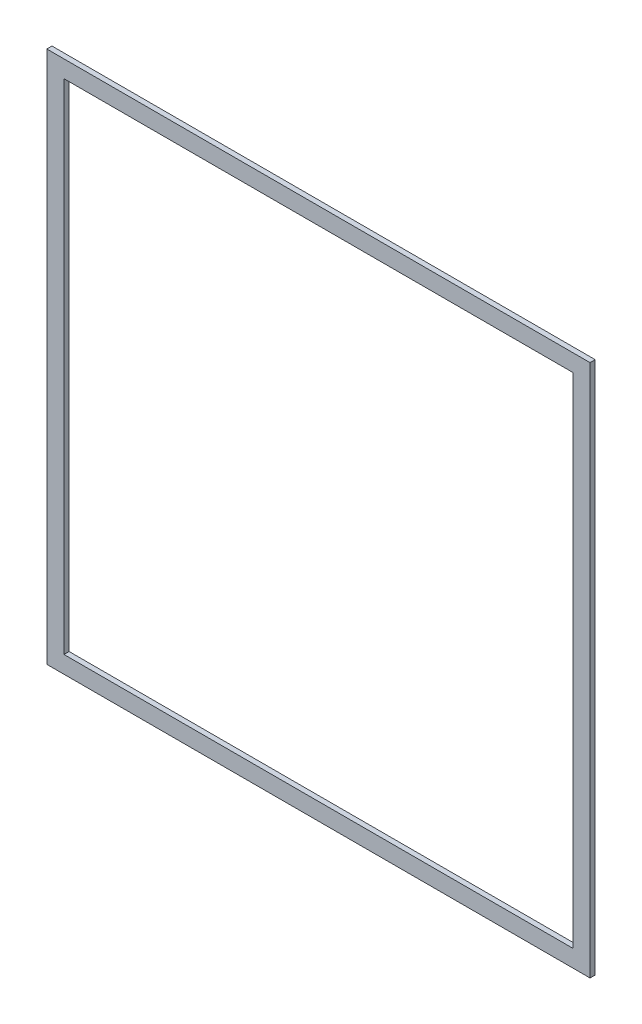
ISO-10303-21;
HEADER;
FILE_DESCRIPTION(('STEP AP214'),'2;1');
FILE_NAME('part.step','',(''),(''),'','','');
FILE_SCHEMA(('AUTOMOTIVE_DESIGN { 1 0 10303 214 1 1 1 1 }'));
ENDSEC;
DATA;
#1=APPLICATION_CONTEXT('core data for automotive mechanical design processes');
#2=APPLICATION_PROTOCOL_DEFINITION('international standard','automotive_design',2000,#1);
#3=PRODUCT_CONTEXT('',#1,'mechanical');
#4=PRODUCT('Part','Part','',(#3));
#5=PRODUCT_RELATED_PRODUCT_CATEGORY('part','',(#4));
#6=PRODUCT_DEFINITION_FORMATION('','',#4);
#7=PRODUCT_DEFINITION_CONTEXT('part definition',#1,'design');
#8=PRODUCT_DEFINITION('design','',#6,#7);
#9=PRODUCT_DEFINITION_SHAPE('','',#8);
#10=(LENGTH_UNIT() NAMED_UNIT(*) SI_UNIT(.MILLI.,.METRE.));
#11=(NAMED_UNIT(*) PLANE_ANGLE_UNIT() SI_UNIT($,.RADIAN.));
#12=(NAMED_UNIT(*) SI_UNIT($,.STERADIAN.) SOLID_ANGLE_UNIT());
#13=UNCERTAINTY_MEASURE_WITH_UNIT(LENGTH_MEASURE(1.E-05),#10,'distance_accuracy_value','');
#14=(GEOMETRIC_REPRESENTATION_CONTEXT(3) GLOBAL_UNCERTAINTY_ASSIGNED_CONTEXT((#13)) GLOBAL_UNIT_ASSIGNED_CONTEXT((#10,
#11,#12)) REPRESENTATION_CONTEXT('',''));
#15=CARTESIAN_POINT('',(0.,0.,0.));
#16=DIRECTION('',(0.,0.,1.));
#17=DIRECTION('',(1.,0.,0.));
#18=AXIS2_PLACEMENT_3D('',#15,#16,#17);
#19=CARTESIAN_POINT('',(0.,0.,3.));
#20=DIRECTION('',(0.,0.,-1.));
#21=DIRECTION('',(-1.,0.,0.));
#22=AXIS2_PLACEMENT_3D('',#19,#20,#21);
#23=PLANE('',#22);
#24=DIRECTION('',(1.,0.,0.));
#25=VECTOR('',#24,1.);
#26=CARTESIAN_POINT('',(10.,0.,3.));
#27=LINE('',#26,#25);
#28=CARTESIAN_POINT('',(0.,0.,3.));
#29=VERTEX_POINT('',#28);
#30=CARTESIAN_POINT('',(316.8,0.,3.));
#31=VERTEX_POINT('',#30);
#32=EDGE_CURVE('E134',#29,#31,#27,.T.);
#33=ORIENTED_EDGE('',*,*,#32,.T.);
#34=DIRECTION('',(0.,1.,0.));
#35=VECTOR('',#34,1.);
#36=CARTESIAN_POINT('',(316.8,310.8,3.));
#37=LINE('',#36,#35);
#38=CARTESIAN_POINT('',(316.8,310.8,3.));
#39=VERTEX_POINT('',#38);
#40=EDGE_CURVE('E136',#31,#39,#37,.T.);
#41=ORIENTED_EDGE('',*,*,#40,.T.);
#42=DIRECTION('',(-1.,0.,0.));
#43=VECTOR('',#42,1.);
#44=CARTESIAN_POINT('',(0.,310.8,3.));
#45=LINE('',#44,#43);
#46=CARTESIAN_POINT('',(0.,310.8,3.));
#47=VERTEX_POINT('',#46);
#48=EDGE_CURVE('E139',#39,#47,#45,.T.);
#49=ORIENTED_EDGE('',*,*,#48,.T.);
#50=DIRECTION('',(0.,-1.,0.));
#51=VECTOR('',#50,1.);
#52=CARTESIAN_POINT('',(0.,0.,3.));
#53=LINE('',#52,#51);
#54=EDGE_CURVE('E141',#47,#29,#53,.T.);
#55=ORIENTED_EDGE('',*,*,#54,.T.);
#56=EDGE_LOOP('',(#33,#41,#49,#55));
#57=FACE_BOUND('',#56,.T.);
#58=DIRECTION('',(0.,-1.,0.));
#59=VECTOR('',#58,1.);
#60=CARTESIAN_POINT('',(10.,300.8,3.));
#61=LINE('',#60,#59);
#62=CARTESIAN_POINT('',(10.,300.8,3.));
#63=VERTEX_POINT('',#62);
#64=CARTESIAN_POINT('',(10.,10.,3.));
#65=VERTEX_POINT('',#64);
#66=EDGE_CURVE('E98',#63,#65,#61,.T.);
#67=ORIENTED_EDGE('',*,*,#66,.F.);
#68=DIRECTION('',(-1.,0.,0.));
#69=VECTOR('',#68,1.);
#70=CARTESIAN_POINT('',(306.8,300.8,3.));
#71=LINE('',#70,#69);
#72=CARTESIAN_POINT('',(306.8,300.8,3.));
#73=VERTEX_POINT('',#72);
#74=EDGE_CURVE('E120',#73,#63,#71,.T.);
#75=ORIENTED_EDGE('',*,*,#74,.F.);
#76=DIRECTION('',(0.,1.,0.));
#77=VECTOR('',#76,1.);
#78=CARTESIAN_POINT('',(306.8,10.,3.));
#79=LINE('',#78,#77);
#80=CARTESIAN_POINT('',(306.8,10.,3.));
#81=VERTEX_POINT('',#80);
#82=EDGE_CURVE('E118',#81,#73,#79,.T.);
#83=ORIENTED_EDGE('',*,*,#82,.F.);
#84=DIRECTION('',(1.,0.,0.));
#85=VECTOR('',#84,1.);
#86=CARTESIAN_POINT('',(10.,10.,3.));
#87=LINE('',#86,#85);
#88=EDGE_CURVE('E106',#65,#81,#87,.T.);
#89=ORIENTED_EDGE('',*,*,#88,.F.);
#90=EDGE_LOOP('',(#67,#75,#83,#89));
#91=FACE_BOUND('',#90,.T.);
#92=ADVANCED_FACE('F33',(#57,#91),#23,.F.);
#93=CARTESIAN_POINT('',(0.,0.,0.));
#94=DIRECTION('',(0.,0.,-1.));
#95=DIRECTION('',(-1.,0.,0.));
#96=AXIS2_PLACEMENT_3D('',#93,#94,#95);
#97=PLANE('',#96);
#98=DIRECTION('',(1.,0.,0.));
#99=VECTOR('',#98,1.);
#100=CARTESIAN_POINT('',(316.8,0.,0.));
#101=LINE('',#100,#99);
#102=CARTESIAN_POINT('',(0.,0.,0.));
#103=VERTEX_POINT('',#102);
#104=CARTESIAN_POINT('',(316.8,0.,0.));
#105=VERTEX_POINT('',#104);
#106=EDGE_CURVE('E114',#103,#105,#101,.T.);
#107=ORIENTED_EDGE('',*,*,#106,.F.);
#108=DIRECTION('',(0.,-1.,0.));
#109=VECTOR('',#108,1.);
#110=CARTESIAN_POINT('',(0.,0.,0.));
#111=LINE('',#110,#109);
#112=CARTESIAN_POINT('',(0.,310.8,0.));
#113=VERTEX_POINT('',#112);
#114=EDGE_CURVE('E137',#113,#103,#111,.T.);
#115=ORIENTED_EDGE('',*,*,#114,.F.);
#116=DIRECTION('',(-1.,0.,0.));
#117=VECTOR('',#116,1.);
#118=CARTESIAN_POINT('',(0.,310.8,0.));
#119=LINE('',#118,#117);
#120=CARTESIAN_POINT('',(316.8,310.8,0.));
#121=VERTEX_POINT('',#120);
#122=EDGE_CURVE('E147',#121,#113,#119,.T.);
#123=ORIENTED_EDGE('',*,*,#122,.F.);
#124=DIRECTION('',(0.,1.,0.));
#125=VECTOR('',#124,1.);
#126=CARTESIAN_POINT('',(316.8,310.8,0.));
#127=LINE('',#126,#125);
#128=EDGE_CURVE('E145',#105,#121,#127,.T.);
#129=ORIENTED_EDGE('',*,*,#128,.F.);
#130=EDGE_LOOP('',(#107,#115,#123,#129));
#131=FACE_BOUND('',#130,.T.);
#132=DIRECTION('',(-1.,0.,0.));
#133=VECTOR('',#132,1.);
#134=CARTESIAN_POINT('',(306.8,300.8,0.));
#135=LINE('',#134,#133);
#136=CARTESIAN_POINT('',(306.8,300.8,0.));
#137=VERTEX_POINT('',#136);
#138=CARTESIAN_POINT('',(10.,300.8,0.));
#139=VERTEX_POINT('',#138);
#140=EDGE_CURVE('E107',#137,#139,#135,.T.);
#141=ORIENTED_EDGE('',*,*,#140,.T.);
#142=DIRECTION('',(0.,-1.,0.));
#143=VECTOR('',#142,1.);
#144=CARTESIAN_POINT('',(10.,300.8,0.));
#145=LINE('',#144,#143);
#146=CARTESIAN_POINT('',(10.,10.,0.));
#147=VERTEX_POINT('',#146);
#148=EDGE_CURVE('E56',#139,#147,#145,.T.);
#149=ORIENTED_EDGE('',*,*,#148,.T.);
#150=DIRECTION('',(1.,0.,0.));
#151=VECTOR('',#150,1.);
#152=CARTESIAN_POINT('',(10.,10.,0.));
#153=LINE('',#152,#151);
#154=CARTESIAN_POINT('',(306.8,10.,0.));
#155=VERTEX_POINT('',#154);
#156=EDGE_CURVE('E113',#147,#155,#153,.T.);
#157=ORIENTED_EDGE('',*,*,#156,.T.);
#158=DIRECTION('',(0.,1.,0.));
#159=VECTOR('',#158,1.);
#160=CARTESIAN_POINT('',(306.8,10.,0.));
#161=LINE('',#160,#159);
#162=EDGE_CURVE('E126',#155,#137,#161,.T.);
#163=ORIENTED_EDGE('',*,*,#162,.T.);
#164=EDGE_LOOP('',(#141,#149,#157,#163));
#165=FACE_BOUND('',#164,.T.);
#166=ADVANCED_FACE('F167',(#131,#165),#97,.T.);
#167=CARTESIAN_POINT('',(316.8,0.,3.));
#168=DIRECTION('',(0.,1.,0.));
#169=DIRECTION('',(-1.,0.,0.));
#170=AXIS2_PLACEMENT_3D('',#167,#168,#169);
#171=PLANE('',#170);
#172=ORIENTED_EDGE('',*,*,#106,.T.);
#173=DIRECTION('',(0.,0.,-1.));
#174=VECTOR('',#173,1.);
#175=CARTESIAN_POINT('',(316.8,0.,3.));
#176=LINE('',#175,#174);
#177=EDGE_CURVE('E11',#31,#105,#176,.T.);
#178=ORIENTED_EDGE('',*,*,#177,.F.);
#179=ORIENTED_EDGE('',*,*,#32,.F.);
#180=DIRECTION('',(0.,0.,-1.));
#181=VECTOR('',#180,1.);
#182=CARTESIAN_POINT('',(0.,0.,3.));
#183=LINE('',#182,#181);
#184=EDGE_CURVE('E143',#29,#103,#183,.T.);
#185=ORIENTED_EDGE('',*,*,#184,.T.);
#186=EDGE_LOOP('',(#172,#178,#179,#185));
#187=FACE_BOUND('',#186,.T.);
#188=ADVANCED_FACE('F35',(#187),#171,.F.);
#189=CARTESIAN_POINT('',(316.8,310.8,3.));
#190=DIRECTION('',(-1.,0.,0.));
#191=DIRECTION('',(0.,-1.,0.));
#192=AXIS2_PLACEMENT_3D('',#189,#190,#191);
#193=PLANE('',#192);
#194=ORIENTED_EDGE('',*,*,#128,.T.);
#195=DIRECTION('',(0.,0.,-1.));
#196=VECTOR('',#195,1.);
#197=CARTESIAN_POINT('',(316.8,310.8,3.));
#198=LINE('',#197,#196);
#199=EDGE_CURVE('E41',#39,#121,#198,.T.);
#200=ORIENTED_EDGE('',*,*,#199,.F.);
#201=ORIENTED_EDGE('',*,*,#40,.F.);
#202=ORIENTED_EDGE('',*,*,#177,.T.);
#203=EDGE_LOOP('',(#194,#200,#201,#202));
#204=FACE_BOUND('',#203,.T.);
#205=ADVANCED_FACE('F177',(#204),#193,.F.);
#206=CARTESIAN_POINT('',(0.,310.8,3.));
#207=DIRECTION('',(0.,-1.,0.));
#208=DIRECTION('',(0.,0.,-1.));
#209=AXIS2_PLACEMENT_3D('',#206,#207,#208);
#210=PLANE('',#209);
#211=ORIENTED_EDGE('',*,*,#122,.T.);
#212=DIRECTION('',(0.,0.,-1.));
#213=VECTOR('',#212,1.);
#214=CARTESIAN_POINT('',(0.,310.8,3.));
#215=LINE('',#214,#213);
#216=EDGE_CURVE('E153',#47,#113,#215,.T.);
#217=ORIENTED_EDGE('',*,*,#216,.F.);
#218=ORIENTED_EDGE('',*,*,#48,.F.);
#219=ORIENTED_EDGE('',*,*,#199,.T.);
#220=EDGE_LOOP('',(#211,#217,#218,#219));
#221=FACE_BOUND('',#220,.T.);
#222=ADVANCED_FACE('F160',(#221),#210,.F.);
#223=CARTESIAN_POINT('',(0.,0.,3.));
#224=DIRECTION('',(1.,0.,0.));
#225=DIRECTION('',(0.,0.,-1.));
#226=AXIS2_PLACEMENT_3D('',#223,#224,#225);
#227=PLANE('',#226);
#228=ORIENTED_EDGE('',*,*,#114,.T.);
#229=ORIENTED_EDGE('',*,*,#184,.F.);
#230=ORIENTED_EDGE('',*,*,#54,.F.);
#231=ORIENTED_EDGE('',*,*,#216,.T.);
#232=EDGE_LOOP('',(#228,#229,#230,#231));
#233=FACE_BOUND('',#232,.T.);
#234=ADVANCED_FACE('F171',(#233),#227,.F.);
#235=CARTESIAN_POINT('',(10.,300.8,3.));
#236=DIRECTION('',(1.,0.,0.));
#237=DIRECTION('',(0.,1.,0.));
#238=AXIS2_PLACEMENT_3D('',#235,#236,#237);
#239=PLANE('',#238);
#240=ORIENTED_EDGE('',*,*,#148,.F.);
#241=DIRECTION('',(0.,0.,-1.));
#242=VECTOR('',#241,1.);
#243=CARTESIAN_POINT('',(10.,300.8,3.));
#244=LINE('',#243,#242);
#245=EDGE_CURVE('E102',#63,#139,#244,.T.);
#246=ORIENTED_EDGE('',*,*,#245,.F.);
#247=ORIENTED_EDGE('',*,*,#66,.T.);
#248=DIRECTION('',(0.,0.,-1.));
#249=VECTOR('',#248,1.);
#250=CARTESIAN_POINT('',(10.,10.,3.));
#251=LINE('',#250,#249);
#252=EDGE_CURVE('E101',#65,#147,#251,.T.);
#253=ORIENTED_EDGE('',*,*,#252,.T.);
#254=EDGE_LOOP('',(#240,#246,#247,#253));
#255=FACE_BOUND('',#254,.T.);
#256=ADVANCED_FACE('F100',(#255),#239,.T.);
#257=CARTESIAN_POINT('',(10.,10.,3.));
#258=DIRECTION('',(0.,1.,0.));
#259=DIRECTION('',(0.,0.,1.));
#260=AXIS2_PLACEMENT_3D('',#257,#258,#259);
#261=PLANE('',#260);
#262=ORIENTED_EDGE('',*,*,#156,.F.);
#263=ORIENTED_EDGE('',*,*,#252,.F.);
#264=ORIENTED_EDGE('',*,*,#88,.T.);
#265=DIRECTION('',(0.,0.,-1.));
#266=VECTOR('',#265,1.);
#267=CARTESIAN_POINT('',(306.8,10.,3.));
#268=LINE('',#267,#266);
#269=EDGE_CURVE('E115',#81,#155,#268,.T.);
#270=ORIENTED_EDGE('',*,*,#269,.T.);
#271=EDGE_LOOP('',(#262,#263,#264,#270));
#272=FACE_BOUND('',#271,.T.);
#273=ADVANCED_FACE('F110',(#272),#261,.T.);
#274=CARTESIAN_POINT('',(306.8,10.,3.));
#275=DIRECTION('',(-1.,0.,0.));
#276=DIRECTION('',(0.,0.,1.));
#277=AXIS2_PLACEMENT_3D('',#274,#275,#276);
#278=PLANE('',#277);
#279=ORIENTED_EDGE('',*,*,#162,.F.);
#280=ORIENTED_EDGE('',*,*,#269,.F.);
#281=ORIENTED_EDGE('',*,*,#82,.T.);
#282=DIRECTION('',(0.,0.,-1.));
#283=VECTOR('',#282,1.);
#284=CARTESIAN_POINT('',(306.8,300.8,3.));
#285=LINE('',#284,#283);
#286=EDGE_CURVE('E48',#73,#137,#285,.T.);
#287=ORIENTED_EDGE('',*,*,#286,.T.);
#288=EDGE_LOOP('',(#279,#280,#281,#287));
#289=FACE_BOUND('',#288,.T.);
#290=ADVANCED_FACE('F200',(#289),#278,.T.);
#291=CARTESIAN_POINT('',(306.8,300.8,3.));
#292=DIRECTION('',(0.,-1.,0.));
#293=DIRECTION('',(1.,0.,0.));
#294=AXIS2_PLACEMENT_3D('',#291,#292,#293);
#295=PLANE('',#294);
#296=ORIENTED_EDGE('',*,*,#140,.F.);
#297=ORIENTED_EDGE('',*,*,#286,.F.);
#298=ORIENTED_EDGE('',*,*,#74,.T.);
#299=ORIENTED_EDGE('',*,*,#245,.T.);
#300=EDGE_LOOP('',(#296,#297,#298,#299));
#301=FACE_BOUND('',#300,.T.);
#302=ADVANCED_FACE('F204',(#301),#295,.T.);
#303=CLOSED_SHELL('',(#92,#166,#188,#205,#222,#234,#256,#273,#290,#302));
#304=MANIFOLD_SOLID_BREP('B2',#303);
#305=ADVANCED_BREP_SHAPE_REPRESENTATION('',(#18,#304),#14);
#306=SHAPE_DEFINITION_REPRESENTATION(#9,#305);
ENDSEC;
END-ISO-10303-21;
